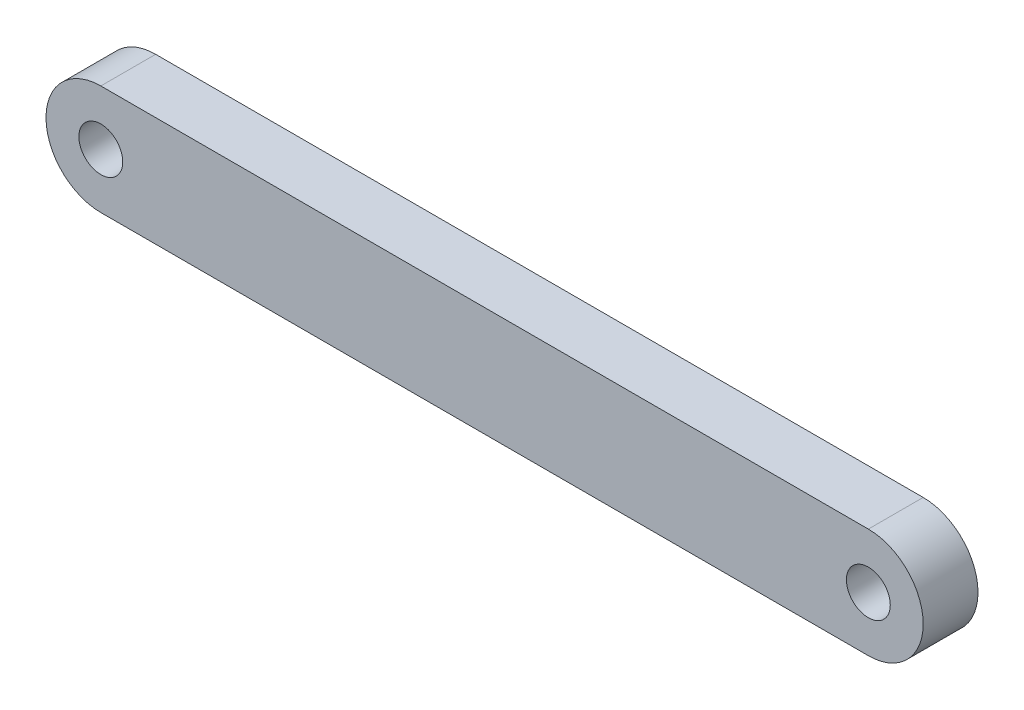
ISO-10303-21;
HEADER;
FILE_DESCRIPTION(('STEP AP214'),'2;1');
FILE_NAME('part.step','',(''),(''),'','','');
FILE_SCHEMA(('AUTOMOTIVE_DESIGN { 1 0 10303 214 1 1 1 1 }'));
ENDSEC;
DATA;
#1=APPLICATION_CONTEXT('core data for automotive mechanical design processes');
#2=APPLICATION_PROTOCOL_DEFINITION('international standard','automotive_design',2000,#1);
#3=PRODUCT_CONTEXT('',#1,'mechanical');
#4=PRODUCT('Part','Part','',(#3));
#5=PRODUCT_RELATED_PRODUCT_CATEGORY('part','',(#4));
#6=PRODUCT_DEFINITION_FORMATION('','',#4);
#7=PRODUCT_DEFINITION_CONTEXT('part definition',#1,'design');
#8=PRODUCT_DEFINITION('design','',#6,#7);
#9=PRODUCT_DEFINITION_SHAPE('','',#8);
#10=(LENGTH_UNIT() NAMED_UNIT(*) SI_UNIT(.MILLI.,.METRE.));
#11=(NAMED_UNIT(*) PLANE_ANGLE_UNIT() SI_UNIT($,.RADIAN.));
#12=(NAMED_UNIT(*) SI_UNIT($,.STERADIAN.) SOLID_ANGLE_UNIT());
#13=UNCERTAINTY_MEASURE_WITH_UNIT(LENGTH_MEASURE(1.E-05),#10,'distance_accuracy_value','');
#14=(GEOMETRIC_REPRESENTATION_CONTEXT(3) GLOBAL_UNCERTAINTY_ASSIGNED_CONTEXT((#13)) GLOBAL_UNIT_ASSIGNED_CONTEXT((#10,
#11,#12)) REPRESENTATION_CONTEXT('',''));
#15=CARTESIAN_POINT('',(0.,0.,0.));
#16=DIRECTION('',(0.,0.,1.));
#17=DIRECTION('',(1.,0.,0.));
#18=AXIS2_PLACEMENT_3D('',#15,#16,#17);
#19=CARTESIAN_POINT('',(-70.,0.,5.));
#20=DIRECTION('',(0.,0.,-1.));
#21=DIRECTION('',(-1.,0.,0.));
#22=AXIS2_PLACEMENT_3D('',#19,#20,#21);
#23=CYLINDRICAL_SURFACE('',#22,10.);
#24=CARTESIAN_POINT('',(-70.,0.,-5.));
#25=DIRECTION('',(0.,0.,1.));
#26=DIRECTION('',(1.,0.,0.));
#27=AXIS2_PLACEMENT_3D('',#24,#25,#26);
#28=CIRCLE('',#27,10.);
#29=CARTESIAN_POINT('',(-70.,10.,-5.));
#30=VERTEX_POINT('',#29);
#31=CARTESIAN_POINT('',(-70.,-10.,-5.));
#32=VERTEX_POINT('',#31);
#33=EDGE_CURVE('E102',#30,#32,#28,.T.);
#34=ORIENTED_EDGE('',*,*,#33,.T.);
#35=DIRECTION('',(0.,0.,-1.));
#36=VECTOR('',#35,1.);
#37=CARTESIAN_POINT('',(-70.,-10.,5.));
#38=LINE('',#37,#36);
#39=CARTESIAN_POINT('',(-70.,-10.,5.));
#40=VERTEX_POINT('',#39);
#41=EDGE_CURVE('E11',#40,#32,#38,.T.);
#42=ORIENTED_EDGE('',*,*,#41,.F.);
#43=CARTESIAN_POINT('',(-70.,0.,5.));
#44=DIRECTION('',(0.,0.,1.));
#45=DIRECTION('',(1.,0.,0.));
#46=AXIS2_PLACEMENT_3D('',#43,#44,#45);
#47=CIRCLE('',#46,10.);
#48=CARTESIAN_POINT('',(-70.,10.,5.));
#49=VERTEX_POINT('',#48);
#50=EDGE_CURVE('E90',#49,#40,#47,.T.);
#51=ORIENTED_EDGE('',*,*,#50,.F.);
#52=DIRECTION('',(0.,0.,-1.));
#53=VECTOR('',#52,1.);
#54=CARTESIAN_POINT('',(-70.,10.,5.));
#55=LINE('',#54,#53);
#56=EDGE_CURVE('E98',#49,#30,#55,.T.);
#57=ORIENTED_EDGE('',*,*,#56,.T.);
#58=EDGE_LOOP('',(#34,#42,#51,#57));
#59=FACE_BOUND('',#58,.T.);
#60=ADVANCED_FACE('F39',(#59),#23,.T.);
#61=CARTESIAN_POINT('',(-70.,-10.,5.));
#62=DIRECTION('',(0.,1.,0.));
#63=DIRECTION('',(-1.,0.,0.));
#64=AXIS2_PLACEMENT_3D('',#61,#62,#63);
#65=PLANE('',#64);
#66=DIRECTION('',(1.,0.,0.));
#67=VECTOR('',#66,1.);
#68=CARTESIAN_POINT('',(-70.,-10.,-5.));
#69=LINE('',#68,#67);
#70=CARTESIAN_POINT('',(70.,-9.99999999999998,-5.));
#71=VERTEX_POINT('',#70);
#72=EDGE_CURVE('E94',#32,#71,#69,.T.);
#73=ORIENTED_EDGE('',*,*,#72,.T.);
#74=DIRECTION('',(0.,0.,-1.));
#75=VECTOR('',#74,1.);
#76=CARTESIAN_POINT('',(70.,-9.99999999999998,5.));
#77=LINE('',#76,#75);
#78=CARTESIAN_POINT('',(70.,-9.99999999999998,5.));
#79=VERTEX_POINT('',#78);
#80=EDGE_CURVE('E47',#79,#71,#77,.T.);
#81=ORIENTED_EDGE('',*,*,#80,.F.);
#82=DIRECTION('',(1.,0.,0.));
#83=VECTOR('',#82,1.);
#84=CARTESIAN_POINT('',(-70.,-10.,5.));
#85=LINE('',#84,#83);
#86=EDGE_CURVE('E85',#40,#79,#85,.T.);
#87=ORIENTED_EDGE('',*,*,#86,.F.);
#88=ORIENTED_EDGE('',*,*,#41,.T.);
#89=EDGE_LOOP('',(#73,#81,#87,#88));
#90=FACE_BOUND('',#89,.T.);
#91=ADVANCED_FACE('F93',(#90),#65,.F.);
#92=CARTESIAN_POINT('',(70.,0.,5.));
#93=DIRECTION('',(0.,0.,-1.));
#94=DIRECTION('',(-1.,0.,0.));
#95=AXIS2_PLACEMENT_3D('',#92,#93,#94);
#96=CYLINDRICAL_SURFACE('',#95,10.);
#97=CARTESIAN_POINT('',(70.,0.,-5.));
#98=DIRECTION('',(0.,0.,1.));
#99=DIRECTION('',(1.,0.,0.));
#100=AXIS2_PLACEMENT_3D('',#97,#98,#99);
#101=CIRCLE('',#100,10.);
#102=CARTESIAN_POINT('',(70.,10.,-5.));
#103=VERTEX_POINT('',#102);
#104=EDGE_CURVE('E72',#71,#103,#101,.T.);
#105=ORIENTED_EDGE('',*,*,#104,.T.);
#106=DIRECTION('',(0.,0.,-1.));
#107=VECTOR('',#106,1.);
#108=CARTESIAN_POINT('',(70.,10.,5.));
#109=LINE('',#108,#107);
#110=CARTESIAN_POINT('',(70.,10.,5.));
#111=VERTEX_POINT('',#110);
#112=EDGE_CURVE('E95',#111,#103,#109,.T.);
#113=ORIENTED_EDGE('',*,*,#112,.F.);
#114=CARTESIAN_POINT('',(70.,0.,5.));
#115=DIRECTION('',(0.,0.,1.));
#116=DIRECTION('',(1.,0.,0.));
#117=AXIS2_PLACEMENT_3D('',#114,#115,#116);
#118=CIRCLE('',#117,10.);
#119=EDGE_CURVE('E88',#79,#111,#118,.T.);
#120=ORIENTED_EDGE('',*,*,#119,.F.);
#121=ORIENTED_EDGE('',*,*,#80,.T.);
#122=EDGE_LOOP('',(#105,#113,#120,#121));
#123=FACE_BOUND('',#122,.T.);
#124=ADVANCED_FACE('F96',(#123),#96,.T.);
#125=CARTESIAN_POINT('',(-70.,10.,5.));
#126=DIRECTION('',(0.,-1.,0.));
#127=DIRECTION('',(1.,0.,0.));
#128=AXIS2_PLACEMENT_3D('',#125,#126,#127);
#129=PLANE('',#128);
#130=DIRECTION('',(-1.,0.,0.));
#131=VECTOR('',#130,1.);
#132=CARTESIAN_POINT('',(-70.,10.,-5.));
#133=LINE('',#132,#131);
#134=EDGE_CURVE('E78',#103,#30,#133,.T.);
#135=ORIENTED_EDGE('',*,*,#134,.T.);
#136=ORIENTED_EDGE('',*,*,#56,.F.);
#137=DIRECTION('',(-1.,0.,0.));
#138=VECTOR('',#137,1.);
#139=CARTESIAN_POINT('',(-70.,10.,5.));
#140=LINE('',#139,#138);
#141=EDGE_CURVE('E55',#111,#49,#140,.T.);
#142=ORIENTED_EDGE('',*,*,#141,.F.);
#143=ORIENTED_EDGE('',*,*,#112,.T.);
#144=EDGE_LOOP('',(#135,#136,#142,#143));
#145=FACE_BOUND('',#144,.T.);
#146=ADVANCED_FACE('F110',(#145),#129,.F.);
#147=CARTESIAN_POINT('',(-70.,0.,5.));
#148=DIRECTION('',(0.,0.,1.));
#149=DIRECTION('',(1.,0.,0.));
#150=AXIS2_PLACEMENT_3D('',#147,#148,#149);
#151=PLANE('',#150);
#152=CARTESIAN_POINT('',(-70.,0.,5.));
#153=DIRECTION('',(0.,0.,1.));
#154=DIRECTION('',(1.,0.,0.));
#155=AXIS2_PLACEMENT_3D('',#152,#153,#154);
#156=CIRCLE('',#155,3.99999999999999);
#157=CARTESIAN_POINT('',(-66.,0.,5.));
#158=VERTEX_POINT('',#157);
#159=EDGE_CURVE('E124',#158,#158,#156,.T.);
#160=ORIENTED_EDGE('',*,*,#159,.F.);
#161=EDGE_LOOP('',(#160));
#162=FACE_BOUND('',#161,.T.);
#163=CARTESIAN_POINT('',(70.,0.,5.));
#164=DIRECTION('',(0.,0.,1.));
#165=DIRECTION('',(1.,0.,0.));
#166=AXIS2_PLACEMENT_3D('',#163,#164,#165);
#167=CIRCLE('',#166,3.99999999999999);
#168=CARTESIAN_POINT('',(74.,0.,5.));
#169=VERTEX_POINT('',#168);
#170=EDGE_CURVE('E118',#169,#169,#167,.T.);
#171=ORIENTED_EDGE('',*,*,#170,.F.);
#172=EDGE_LOOP('',(#171));
#173=FACE_BOUND('',#172,.T.);
#174=ORIENTED_EDGE('',*,*,#50,.T.);
#175=ORIENTED_EDGE('',*,*,#86,.T.);
#176=ORIENTED_EDGE('',*,*,#119,.T.);
#177=ORIENTED_EDGE('',*,*,#141,.T.);
#178=EDGE_LOOP('',(#174,#175,#176,#177));
#179=FACE_BOUND('',#178,.T.);
#180=ADVANCED_FACE('F86',(#162,#173,#179),#151,.T.);
#181=CARTESIAN_POINT('',(-70.,0.,-5.));
#182=DIRECTION('',(0.,0.,1.));
#183=DIRECTION('',(1.,0.,0.));
#184=AXIS2_PLACEMENT_3D('',#181,#182,#183);
#185=PLANE('',#184);
#186=CARTESIAN_POINT('',(-70.,0.,-5.));
#187=DIRECTION('',(0.,0.,1.));
#188=DIRECTION('',(1.,0.,0.));
#189=AXIS2_PLACEMENT_3D('',#186,#187,#188);
#190=CIRCLE('',#189,4.);
#191=CARTESIAN_POINT('',(-66.,0.,-5.));
#192=VERTEX_POINT('',#191);
#193=EDGE_CURVE('E121',#192,#192,#190,.T.);
#194=ORIENTED_EDGE('',*,*,#193,.T.);
#195=EDGE_LOOP('',(#194));
#196=FACE_BOUND('',#195,.T.);
#197=CARTESIAN_POINT('',(70.,0.,-5.));
#198=DIRECTION('',(0.,0.,1.));
#199=DIRECTION('',(1.,0.,0.));
#200=AXIS2_PLACEMENT_3D('',#197,#198,#199);
#201=CIRCLE('',#200,4.);
#202=CARTESIAN_POINT('',(74.,0.,-5.));
#203=VERTEX_POINT('',#202);
#204=EDGE_CURVE('E105',#203,#203,#201,.T.);
#205=ORIENTED_EDGE('',*,*,#204,.T.);
#206=EDGE_LOOP('',(#205));
#207=FACE_BOUND('',#206,.T.);
#208=ORIENTED_EDGE('',*,*,#33,.F.);
#209=ORIENTED_EDGE('',*,*,#134,.F.);
#210=ORIENTED_EDGE('',*,*,#104,.F.);
#211=ORIENTED_EDGE('',*,*,#72,.F.);
#212=EDGE_LOOP('',(#208,#209,#210,#211));
#213=FACE_BOUND('',#212,.T.);
#214=ADVANCED_FACE('F113',(#196,#207,#213),#185,.F.);
#215=CARTESIAN_POINT('',(70.,0.,5.));
#216=DIRECTION('',(0.,0.,1.));
#217=DIRECTION('',(1.,0.,0.));
#218=AXIS2_PLACEMENT_3D('',#215,#216,#217);
#219=CYLINDRICAL_SURFACE('',#218,4.);
#220=ORIENTED_EDGE('',*,*,#204,.F.);
#221=EDGE_LOOP('',(#220));
#222=FACE_BOUND('',#221,.T.);
#223=ORIENTED_EDGE('',*,*,#170,.T.);
#224=EDGE_LOOP('',(#223));
#225=FACE_BOUND('',#224,.T.);
#226=ADVANCED_FACE('F135',(#222,#225),#219,.F.);
#227=CARTESIAN_POINT('',(-70.,0.,5.));
#228=DIRECTION('',(0.,0.,1.));
#229=DIRECTION('',(1.,0.,0.));
#230=AXIS2_PLACEMENT_3D('',#227,#228,#229);
#231=CYLINDRICAL_SURFACE('',#230,4.);
#232=ORIENTED_EDGE('',*,*,#193,.F.);
#233=EDGE_LOOP('',(#232));
#234=FACE_BOUND('',#233,.T.);
#235=ORIENTED_EDGE('',*,*,#159,.T.);
#236=EDGE_LOOP('',(#235));
#237=FACE_BOUND('',#236,.T.);
#238=ADVANCED_FACE('F128',(#234,#237),#231,.F.);
#239=CLOSED_SHELL('',(#60,#91,#124,#146,#180,#214,#226,#238));
#240=MANIFOLD_SOLID_BREP('B2',#239);
#241=ADVANCED_BREP_SHAPE_REPRESENTATION('',(#18,#240),#14);
#242=SHAPE_DEFINITION_REPRESENTATION(#9,#241);
ENDSEC;
END-ISO-10303-21;
